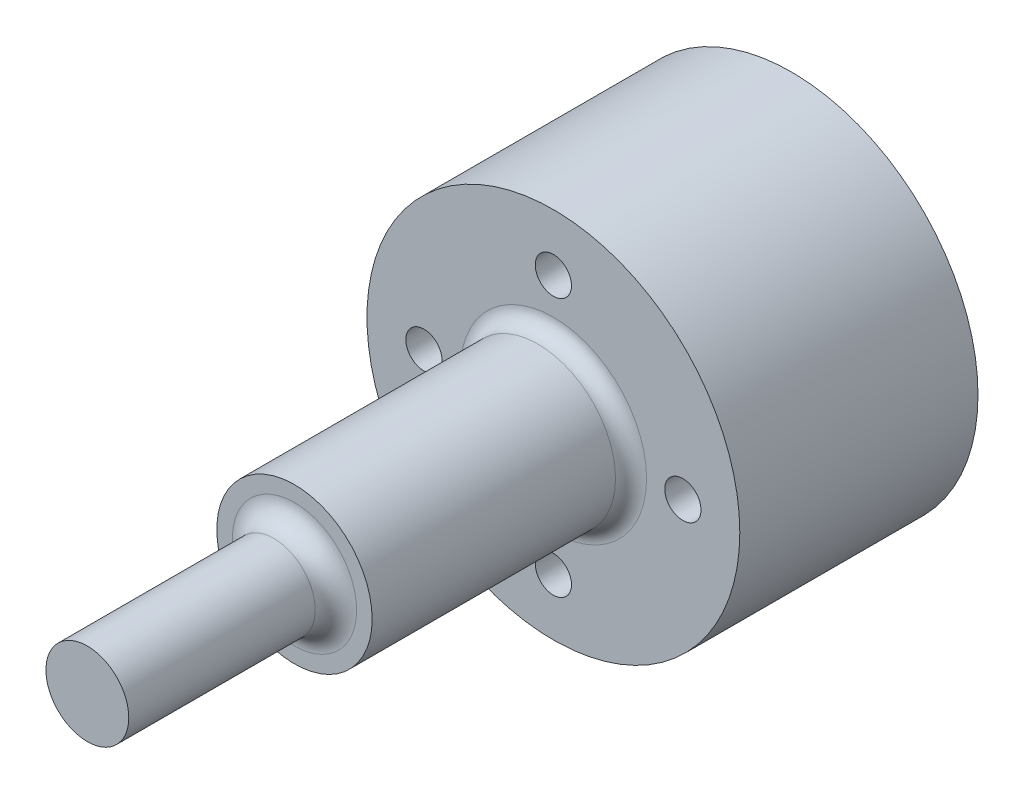
ISO-10303-21;
HEADER;
FILE_DESCRIPTION(('STEP AP214'),'2;1');
FILE_NAME('part.step','',(''),(''),'','','');
FILE_SCHEMA(('AUTOMOTIVE_DESIGN { 1 0 10303 214 1 1 1 1 }'));
ENDSEC;
DATA;
#1=APPLICATION_CONTEXT('core data for automotive mechanical design processes');
#2=APPLICATION_PROTOCOL_DEFINITION('international standard','automotive_design',2000,#1);
#3=PRODUCT_CONTEXT('',#1,'mechanical');
#4=PRODUCT('Part','Part','',(#3));
#5=PRODUCT_RELATED_PRODUCT_CATEGORY('part','',(#4));
#6=PRODUCT_DEFINITION_FORMATION('','',#4);
#7=PRODUCT_DEFINITION_CONTEXT('part definition',#1,'design');
#8=PRODUCT_DEFINITION('design','',#6,#7);
#9=PRODUCT_DEFINITION_SHAPE('','',#8);
#10=(LENGTH_UNIT() NAMED_UNIT(*) SI_UNIT(.MILLI.,.METRE.));
#11=(NAMED_UNIT(*) PLANE_ANGLE_UNIT() SI_UNIT($,.RADIAN.));
#12=(NAMED_UNIT(*) SI_UNIT($,.STERADIAN.) SOLID_ANGLE_UNIT());
#13=UNCERTAINTY_MEASURE_WITH_UNIT(LENGTH_MEASURE(1.E-05),#10,'distance_accuracy_value','');
#14=(GEOMETRIC_REPRESENTATION_CONTEXT(3) GLOBAL_UNCERTAINTY_ASSIGNED_CONTEXT((#13)) GLOBAL_UNIT_ASSIGNED_CONTEXT((#10,
#11,#12)) REPRESENTATION_CONTEXT('',''));
#15=CARTESIAN_POINT('',(0.,0.,0.));
#16=DIRECTION('',(0.,0.,1.));
#17=DIRECTION('',(1.,0.,0.));
#18=AXIS2_PLACEMENT_3D('',#15,#16,#17);
#19=CARTESIAN_POINT('',(0.,0.,0.));
#20=DIRECTION('',(0.,0.,1.));
#21=DIRECTION('',(1.,0.,0.));
#22=AXIS2_PLACEMENT_3D('',#19,#20,#21);
#23=PLANE('',#22);
#24=CARTESIAN_POINT('',(0.,0.,0.));
#25=DIRECTION('',(0.,0.,1.));
#26=DIRECTION('',(1.,0.,0.));
#27=AXIS2_PLACEMENT_3D('',#24,#25,#26);
#28=CIRCLE('',#27,18.);
#29=CARTESIAN_POINT('',(18.,0.,0.));
#30=VERTEX_POINT('',#29);
#31=EDGE_CURVE('E60',#30,#30,#28,.T.);
#32=ORIENTED_EDGE('',*,*,#31,.F.);
#33=EDGE_LOOP('',(#32));
#34=FACE_BOUND('',#33,.T.);
#35=CARTESIAN_POINT('',(0.,0.,0.));
#36=DIRECTION('',(0.,0.,1.));
#37=DIRECTION('',(1.,0.,0.));
#38=AXIS2_PLACEMENT_3D('',#35,#36,#37);
#39=CIRCLE('',#38,15.);
#40=CARTESIAN_POINT('',(15.,0.,0.));
#41=VERTEX_POINT('',#40);
#42=EDGE_CURVE('E70',#41,#41,#39,.T.);
#43=ORIENTED_EDGE('',*,*,#42,.T.);
#44=EDGE_LOOP('',(#43));
#45=FACE_BOUND('',#44,.T.);
#46=ADVANCED_FACE('F36',(#34,#45),#23,.F.);
#47=CARTESIAN_POINT('',(0.,0.,20.));
#48=DIRECTION('',(0.,0.,-1.));
#49=DIRECTION('',(-1.,0.,0.));
#50=AXIS2_PLACEMENT_3D('',#47,#48,#49);
#51=CYLINDRICAL_SURFACE('',#50,18.);
#52=ORIENTED_EDGE('',*,*,#31,.T.);
#53=EDGE_LOOP('',(#52));
#54=FACE_BOUND('',#53,.T.);
#55=CARTESIAN_POINT('',(0.,0.,23.));
#56=DIRECTION('',(0.,0.,1.));
#57=DIRECTION('',(1.,0.,0.));
#58=AXIS2_PLACEMENT_3D('',#55,#56,#57);
#59=CIRCLE('',#58,18.);
#60=CARTESIAN_POINT('',(18.,0.,23.));
#61=VERTEX_POINT('',#60);
#62=EDGE_CURVE('E65',#61,#61,#59,.T.);
#63=ORIENTED_EDGE('',*,*,#62,.F.);
#64=EDGE_LOOP('',(#63));
#65=FACE_BOUND('',#64,.T.);
#66=ADVANCED_FACE('F142',(#54,#65),#51,.T.);
#67=CARTESIAN_POINT('',(0.,0.,20.));
#68=DIRECTION('',(0.,0.,-1.));
#69=DIRECTION('',(-1.,0.,0.));
#70=AXIS2_PLACEMENT_3D('',#67,#68,#69);
#71=CYLINDRICAL_SURFACE('',#70,15.);
#72=CARTESIAN_POINT('',(0.,0.,20.));
#73=DIRECTION('',(0.,0.,1.));
#74=DIRECTION('',(1.,0.,0.));
#75=AXIS2_PLACEMENT_3D('',#72,#73,#74);
#76=CIRCLE('',#75,15.);
#77=CARTESIAN_POINT('',(15.,0.,20.));
#78=VERTEX_POINT('',#77);
#79=EDGE_CURVE('E74',#78,#78,#76,.T.);
#80=ORIENTED_EDGE('',*,*,#79,.T.);
#81=EDGE_LOOP('',(#80));
#82=FACE_BOUND('',#81,.T.);
#83=ORIENTED_EDGE('',*,*,#42,.F.);
#84=EDGE_LOOP('',(#83));
#85=FACE_BOUND('',#84,.T.);
#86=ADVANCED_FACE('F144',(#82,#85),#71,.F.);
#87=CARTESIAN_POINT('',(0.,0.,20.));
#88=DIRECTION('',(0.,0.,1.));
#89=DIRECTION('',(1.,0.,0.));
#90=AXIS2_PLACEMENT_3D('',#87,#88,#89);
#91=PLANE('',#90);
#92=CARTESIAN_POINT('',(0.,12.5,20.));
#93=DIRECTION('',(0.,0.,1.));
#94=DIRECTION('',(1.,0.,0.));
#95=AXIS2_PLACEMENT_3D('',#92,#93,#94);
#96=CIRCLE('',#95,1.75);
#97=CARTESIAN_POINT('',(1.75,12.5,20.));
#98=VERTEX_POINT('',#97);
#99=EDGE_CURVE('E92',#98,#98,#96,.T.);
#100=ORIENTED_EDGE('',*,*,#99,.T.);
#101=EDGE_LOOP('',(#100));
#102=FACE_BOUND('',#101,.T.);
#103=CARTESIAN_POINT('',(12.5000000000002,1.59770132505957E-13,20.));
#104=DIRECTION('',(0.,0.,1.));
#105=DIRECTION('',(1.,0.,0.));
#106=AXIS2_PLACEMENT_3D('',#103,#104,#105);
#107=CIRCLE('',#106,1.75);
#108=CARTESIAN_POINT('',(14.2500000000002,1.59770132505957E-13,20.));
#109=VERTEX_POINT('',#108);
#110=EDGE_CURVE('E96',#109,#109,#107,.T.);
#111=ORIENTED_EDGE('',*,*,#110,.T.);
#112=EDGE_LOOP('',(#111));
#113=FACE_BOUND('',#112,.T.);
#114=CARTESIAN_POINT('',(3.19540265011915E-13,-12.5,20.));
#115=DIRECTION('',(0.,0.,1.));
#116=DIRECTION('',(1.,0.,0.));
#117=AXIS2_PLACEMENT_3D('',#114,#115,#116);
#118=CIRCLE('',#117,1.75);
#119=CARTESIAN_POINT('',(1.75000000000032,-12.5,20.));
#120=VERTEX_POINT('',#119);
#121=EDGE_CURVE('E100',#120,#120,#118,.T.);
#122=ORIENTED_EDGE('',*,*,#121,.T.);
#123=EDGE_LOOP('',(#122));
#124=FACE_BOUND('',#123,.T.);
#125=CARTESIAN_POINT('',(-12.4999999999998,-1.61300941004891E-13,20.));
#126=DIRECTION('',(0.,0.,1.));
#127=DIRECTION('',(1.,0.,0.));
#128=AXIS2_PLACEMENT_3D('',#125,#126,#127);
#129=CIRCLE('',#128,1.75);
#130=CARTESIAN_POINT('',(-10.7499999999998,-1.61300941004891E-13,20.));
#131=VERTEX_POINT('',#130);
#132=EDGE_CURVE('E104',#131,#131,#129,.T.);
#133=ORIENTED_EDGE('',*,*,#132,.T.);
#134=EDGE_LOOP('',(#133));
#135=FACE_BOUND('',#134,.T.);
#136=CARTESIAN_POINT('',(0.,0.,20.));
#137=DIRECTION('',(0.,0.,1.));
#138=DIRECTION('',(1.,0.,0.));
#139=AXIS2_PLACEMENT_3D('',#136,#137,#138);
#140=CIRCLE('',#139,4.5);
#141=CARTESIAN_POINT('',(4.5,0.,20.));
#142=VERTEX_POINT('',#141);
#143=EDGE_CURVE('E61',#142,#142,#140,.T.);
#144=ORIENTED_EDGE('',*,*,#143,.T.);
#145=EDGE_LOOP('',(#144));
#146=FACE_BOUND('',#145,.T.);
#147=ORIENTED_EDGE('',*,*,#79,.F.);
#148=EDGE_LOOP('',(#147));
#149=FACE_BOUND('',#148,.T.);
#150=ADVANCED_FACE('F132',(#102,#113,#124,#135,#146,#149),#91,.F.);
#151=CARTESIAN_POINT('',(0.,0.,23.));
#152=DIRECTION('',(0.,0.,1.));
#153=DIRECTION('',(1.,0.,0.));
#154=AXIS2_PLACEMENT_3D('',#151,#152,#153);
#155=PLANE('',#154);
#156=CARTESIAN_POINT('',(0.,0.,23.));
#157=DIRECTION('',(0.,0.,1.));
#158=DIRECTION('',(1.,0.,0.));
#159=AXIS2_PLACEMENT_3D('',#156,#157,#158);
#160=CIRCLE('',#159,9.);
#161=CARTESIAN_POINT('',(9.,0.,23.));
#162=VERTEX_POINT('',#161);
#163=EDGE_CURVE('E10',#162,#162,#160,.F.);
#164=ORIENTED_EDGE('',*,*,#163,.T.);
#165=EDGE_LOOP('',(#164));
#166=FACE_BOUND('',#165,.T.);
#167=CARTESIAN_POINT('',(0.,12.5,23.));
#168=DIRECTION('',(0.,0.,1.));
#169=DIRECTION('',(1.,0.,0.));
#170=AXIS2_PLACEMENT_3D('',#167,#168,#169);
#171=CIRCLE('',#170,1.75);
#172=CARTESIAN_POINT('',(1.75,12.5,23.));
#173=VERTEX_POINT('',#172);
#174=EDGE_CURVE('E108',#173,#173,#171,.T.);
#175=ORIENTED_EDGE('',*,*,#174,.F.);
#176=EDGE_LOOP('',(#175));
#177=FACE_BOUND('',#176,.T.);
#178=CARTESIAN_POINT('',(12.5000000000002,1.59770132505957E-13,23.));
#179=DIRECTION('',(0.,0.,1.));
#180=DIRECTION('',(1.,0.,0.));
#181=AXIS2_PLACEMENT_3D('',#178,#179,#180);
#182=CIRCLE('',#181,1.75);
#183=CARTESIAN_POINT('',(14.2500000000002,1.59770132505957E-13,23.));
#184=VERTEX_POINT('',#183);
#185=EDGE_CURVE('E117',#184,#184,#182,.T.);
#186=ORIENTED_EDGE('',*,*,#185,.F.);
#187=EDGE_LOOP('',(#186));
#188=FACE_BOUND('',#187,.T.);
#189=CARTESIAN_POINT('',(3.19540265011915E-13,-12.5,23.));
#190=DIRECTION('',(0.,0.,1.));
#191=DIRECTION('',(1.,0.,0.));
#192=AXIS2_PLACEMENT_3D('',#189,#190,#191);
#193=CIRCLE('',#192,1.75);
#194=CARTESIAN_POINT('',(1.75000000000032,-12.5,23.));
#195=VERTEX_POINT('',#194);
#196=EDGE_CURVE('E113',#195,#195,#193,.T.);
#197=ORIENTED_EDGE('',*,*,#196,.F.);
#198=EDGE_LOOP('',(#197));
#199=FACE_BOUND('',#198,.T.);
#200=CARTESIAN_POINT('',(-12.4999999999998,-1.61300941004891E-13,23.));
#201=DIRECTION('',(0.,0.,1.));
#202=DIRECTION('',(1.,0.,0.));
#203=AXIS2_PLACEMENT_3D('',#200,#201,#202);
#204=CIRCLE('',#203,1.75);
#205=CARTESIAN_POINT('',(-10.7499999999998,-1.61300941004891E-13,23.));
#206=VERTEX_POINT('',#205);
#207=EDGE_CURVE('E109',#206,#206,#204,.T.);
#208=ORIENTED_EDGE('',*,*,#207,.F.);
#209=EDGE_LOOP('',(#208));
#210=FACE_BOUND('',#209,.T.);
#211=ORIENTED_EDGE('',*,*,#62,.T.);
#212=EDGE_LOOP('',(#211));
#213=FACE_BOUND('',#212,.T.);
#214=ADVANCED_FACE('F128',(#166,#177,#188,#199,#210,#213),#155,.T.);
#215=CARTESIAN_POINT('',(0.,0.,43.));
#216=DIRECTION('',(0.,0.,-1.));
#217=DIRECTION('',(-1.,0.,0.));
#218=AXIS2_PLACEMENT_3D('',#215,#216,#217);
#219=CYLINDRICAL_SURFACE('',#218,7.5);
#220=CARTESIAN_POINT('',(0.,0.,24.5));
#221=DIRECTION('',(0.,0.,1.));
#222=DIRECTION('',(1.,0.,0.));
#223=AXIS2_PLACEMENT_3D('',#220,#221,#222);
#224=CIRCLE('',#223,7.5);
#225=CARTESIAN_POINT('',(7.5,0.,24.5));
#226=VERTEX_POINT('',#225);
#227=EDGE_CURVE('E44',#226,#226,#224,.T.);
#228=ORIENTED_EDGE('',*,*,#227,.T.);
#229=EDGE_LOOP('',(#228));
#230=FACE_BOUND('',#229,.T.);
#231=CARTESIAN_POINT('',(0.,0.,48.));
#232=DIRECTION('',(0.,0.,1.));
#233=DIRECTION('',(1.,0.,0.));
#234=AXIS2_PLACEMENT_3D('',#231,#232,#233);
#235=CIRCLE('',#234,7.5);
#236=CARTESIAN_POINT('',(7.5,0.,48.));
#237=VERTEX_POINT('',#236);
#238=EDGE_CURVE('E84',#237,#237,#235,.T.);
#239=ORIENTED_EDGE('',*,*,#238,.F.);
#240=EDGE_LOOP('',(#239));
#241=FACE_BOUND('',#240,.T.);
#242=ADVANCED_FACE('F131',(#230,#241),#219,.T.);
#243=CARTESIAN_POINT('',(0.,0.,43.));
#244=DIRECTION('',(0.,0.,-1.));
#245=DIRECTION('',(-1.,0.,0.));
#246=AXIS2_PLACEMENT_3D('',#243,#244,#245);
#247=CYLINDRICAL_SURFACE('',#246,4.5);
#248=CARTESIAN_POINT('',(0.,0.,43.));
#249=DIRECTION('',(0.,0.,1.));
#250=DIRECTION('',(1.,0.,0.));
#251=AXIS2_PLACEMENT_3D('',#248,#249,#250);
#252=CIRCLE('',#251,4.5);
#253=CARTESIAN_POINT('',(4.5,0.,43.));
#254=VERTEX_POINT('',#253);
#255=EDGE_CURVE('E66',#254,#254,#252,.T.);
#256=ORIENTED_EDGE('',*,*,#255,.T.);
#257=EDGE_LOOP('',(#256));
#258=FACE_BOUND('',#257,.T.);
#259=ORIENTED_EDGE('',*,*,#143,.F.);
#260=EDGE_LOOP('',(#259));
#261=FACE_BOUND('',#260,.T.);
#262=ADVANCED_FACE('F194',(#258,#261),#247,.F.);
#263=CARTESIAN_POINT('',(0.,0.,43.));
#264=DIRECTION('',(0.,0.,1.));
#265=DIRECTION('',(1.,0.,0.));
#266=AXIS2_PLACEMENT_3D('',#263,#264,#265);
#267=PLANE('',#266);
#268=ORIENTED_EDGE('',*,*,#255,.F.);
#269=EDGE_LOOP('',(#268));
#270=FACE_BOUND('',#269,.T.);
#271=ADVANCED_FACE('F190',(#270),#267,.F.);
#272=CARTESIAN_POINT('',(0.,0.,48.));
#273=DIRECTION('',(0.,0.,1.));
#274=DIRECTION('',(1.,0.,0.));
#275=AXIS2_PLACEMENT_3D('',#272,#273,#274);
#276=PLANE('',#275);
#277=CARTESIAN_POINT('',(0.,0.,48.));
#278=DIRECTION('',(0.,0.,1.));
#279=DIRECTION('',(1.,0.,0.));
#280=AXIS2_PLACEMENT_3D('',#277,#278,#279);
#281=CIRCLE('',#280,6.);
#282=CARTESIAN_POINT('',(6.,0.,48.));
#283=VERTEX_POINT('',#282);
#284=EDGE_CURVE('E49',#283,#283,#281,.F.);
#285=ORIENTED_EDGE('',*,*,#284,.T.);
#286=EDGE_LOOP('',(#285));
#287=FACE_BOUND('',#286,.T.);
#288=ORIENTED_EDGE('',*,*,#238,.T.);
#289=EDGE_LOOP('',(#288));
#290=FACE_BOUND('',#289,.T.);
#291=ADVANCED_FACE('F173',(#287,#290),#276,.T.);
#292=CARTESIAN_POINT('',(0.,0.,68.));
#293=DIRECTION('',(0.,0.,-1.));
#294=DIRECTION('',(-1.,0.,0.));
#295=AXIS2_PLACEMENT_3D('',#292,#293,#294);
#296=CYLINDRICAL_SURFACE('',#295,4.);
#297=CARTESIAN_POINT('',(0.,0.,50.));
#298=DIRECTION('',(0.,0.,1.));
#299=DIRECTION('',(1.,0.,0.));
#300=AXIS2_PLACEMENT_3D('',#297,#298,#299);
#301=CIRCLE('',#300,4.);
#302=CARTESIAN_POINT('',(4.,0.,50.));
#303=VERTEX_POINT('',#302);
#304=EDGE_CURVE('E54',#303,#303,#301,.T.);
#305=ORIENTED_EDGE('',*,*,#304,.T.);
#306=EDGE_LOOP('',(#305));
#307=FACE_BOUND('',#306,.T.);
#308=CARTESIAN_POINT('',(0.,0.,68.));
#309=DIRECTION('',(0.,0.,1.));
#310=DIRECTION('',(1.,0.,0.));
#311=AXIS2_PLACEMENT_3D('',#308,#309,#310);
#312=CIRCLE('',#311,4.);
#313=CARTESIAN_POINT('',(4.,0.,68.));
#314=VERTEX_POINT('',#313);
#315=EDGE_CURVE('E88',#314,#314,#312,.T.);
#316=ORIENTED_EDGE('',*,*,#315,.F.);
#317=EDGE_LOOP('',(#316));
#318=FACE_BOUND('',#317,.T.);
#319=ADVANCED_FACE('F169',(#307,#318),#296,.T.);
#320=CARTESIAN_POINT('',(0.,0.,68.));
#321=DIRECTION('',(0.,0.,1.));
#322=DIRECTION('',(1.,0.,0.));
#323=AXIS2_PLACEMENT_3D('',#320,#321,#322);
#324=PLANE('',#323);
#325=ORIENTED_EDGE('',*,*,#315,.T.);
#326=EDGE_LOOP('',(#325));
#327=FACE_BOUND('',#326,.T.);
#328=ADVANCED_FACE('F172',(#327),#324,.T.);
#329=CARTESIAN_POINT('',(-12.4999999999998,-1.61300941004891E-13,8.));
#330=DIRECTION('',(0.,0.,1.));
#331=DIRECTION('',(1.,0.,0.));
#332=AXIS2_PLACEMENT_3D('',#329,#330,#331);
#333=CYLINDRICAL_SURFACE('',#332,1.75);
#334=ORIENTED_EDGE('',*,*,#207,.T.);
#335=EDGE_LOOP('',(#334));
#336=FACE_BOUND('',#335,.T.);
#337=ORIENTED_EDGE('',*,*,#132,.F.);
#338=EDGE_LOOP('',(#337));
#339=FACE_BOUND('',#338,.T.);
#340=ADVANCED_FACE('F178',(#336,#339),#333,.F.);
#341=CARTESIAN_POINT('',(3.19540265011915E-13,-12.5,8.));
#342=DIRECTION('',(0.,0.,1.));
#343=DIRECTION('',(1.,0.,0.));
#344=AXIS2_PLACEMENT_3D('',#341,#342,#343);
#345=CYLINDRICAL_SURFACE('',#344,1.75);
#346=ORIENTED_EDGE('',*,*,#196,.T.);
#347=EDGE_LOOP('',(#346));
#348=FACE_BOUND('',#347,.T.);
#349=ORIENTED_EDGE('',*,*,#121,.F.);
#350=EDGE_LOOP('',(#349));
#351=FACE_BOUND('',#350,.T.);
#352=ADVANCED_FACE('F183',(#348,#351),#345,.F.);
#353=CARTESIAN_POINT('',(12.5000000000002,1.59770132505957E-13,8.));
#354=DIRECTION('',(0.,0.,1.));
#355=DIRECTION('',(1.,0.,0.));
#356=AXIS2_PLACEMENT_3D('',#353,#354,#355);
#357=CYLINDRICAL_SURFACE('',#356,1.75);
#358=ORIENTED_EDGE('',*,*,#185,.T.);
#359=EDGE_LOOP('',(#358));
#360=FACE_BOUND('',#359,.T.);
#361=ORIENTED_EDGE('',*,*,#110,.F.);
#362=EDGE_LOOP('',(#361));
#363=FACE_BOUND('',#362,.T.);
#364=ADVANCED_FACE('F163',(#360,#363),#357,.F.);
#365=CARTESIAN_POINT('',(0.,12.5,8.));
#366=DIRECTION('',(0.,0.,1.));
#367=DIRECTION('',(1.,0.,0.));
#368=AXIS2_PLACEMENT_3D('',#365,#366,#367);
#369=CYLINDRICAL_SURFACE('',#368,1.75);
#370=ORIENTED_EDGE('',*,*,#174,.T.);
#371=EDGE_LOOP('',(#370));
#372=FACE_BOUND('',#371,.T.);
#373=ORIENTED_EDGE('',*,*,#99,.F.);
#374=EDGE_LOOP('',(#373));
#375=FACE_BOUND('',#374,.T.);
#376=ADVANCED_FACE('F125',(#372,#375),#369,.F.);
#377=CARTESIAN_POINT('',(0.,0.,50.));
#378=DIRECTION('',(0.,0.,1.));
#379=DIRECTION('',(1.,0.,0.));
#380=AXIS2_PLACEMENT_3D('',#377,#378,#379);
#381=TOROIDAL_SURFACE('',#380,6.,2.);
#382=ORIENTED_EDGE('',*,*,#284,.F.);
#383=EDGE_LOOP('',(#382));
#384=FACE_BOUND('',#383,.T.);
#385=ORIENTED_EDGE('',*,*,#304,.F.);
#386=EDGE_LOOP('',(#385));
#387=FACE_BOUND('',#386,.T.);
#388=ADVANCED_FACE('F155',(#384,#387),#381,.F.);
#389=CARTESIAN_POINT('',(0.,0.,24.5));
#390=DIRECTION('',(0.,0.,1.));
#391=DIRECTION('',(1.,0.,0.));
#392=AXIS2_PLACEMENT_3D('',#389,#390,#391);
#393=TOROIDAL_SURFACE('',#392,9.,1.5);
#394=ORIENTED_EDGE('',*,*,#163,.F.);
#395=EDGE_LOOP('',(#394));
#396=FACE_BOUND('',#395,.T.);
#397=ORIENTED_EDGE('',*,*,#227,.F.);
#398=EDGE_LOOP('',(#397));
#399=FACE_BOUND('',#398,.T.);
#400=ADVANCED_FACE('F38',(#396,#399),#393,.F.);
#401=CLOSED_SHELL('',(#46,#66,#86,#150,#214,#242,#262,#271,#291,#319,#328,#340,#352,#364,#376,
#388,#400));
#402=MANIFOLD_SOLID_BREP('B2',#401);
#403=ADVANCED_BREP_SHAPE_REPRESENTATION('',(#18,#402),#14);
#404=SHAPE_DEFINITION_REPRESENTATION(#9,#403);
ENDSEC;
END-ISO-10303-21;
